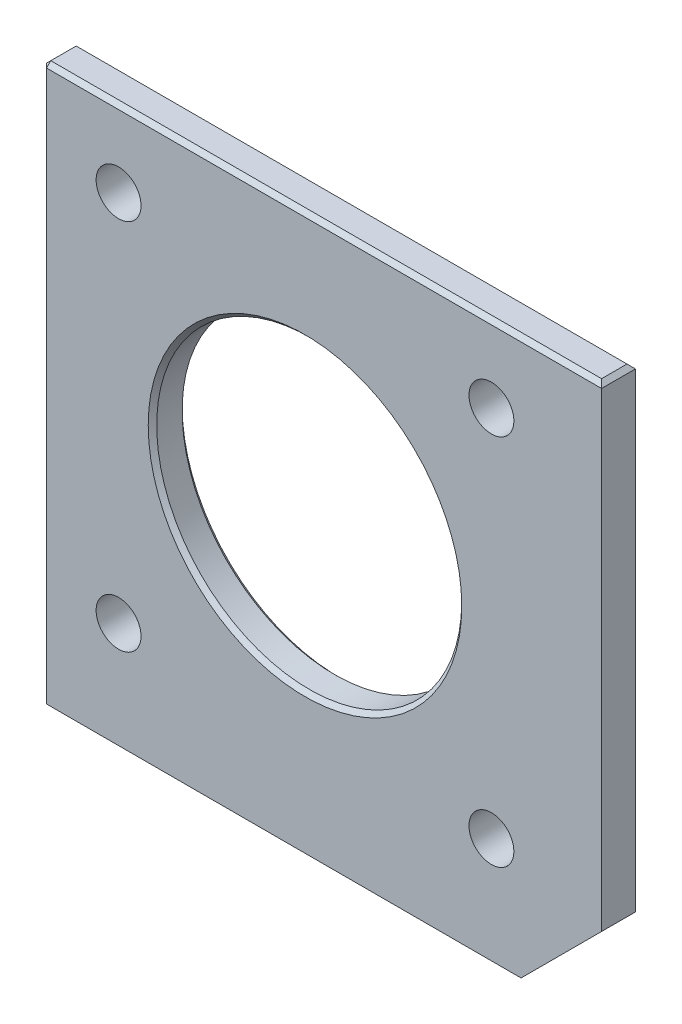
ISO-10303-21;
HEADER;
FILE_DESCRIPTION(('STEP AP214'),'2;1');
FILE_NAME('part.step','',(''),(''),'','','');
FILE_SCHEMA(('AUTOMOTIVE_DESIGN { 1 0 10303 214 1 1 1 1 }'));
ENDSEC;
DATA;
#1=APPLICATION_CONTEXT('core data for automotive mechanical design processes');
#2=APPLICATION_PROTOCOL_DEFINITION('international standard','automotive_design',2000,#1);
#3=PRODUCT_CONTEXT('',#1,'mechanical');
#4=PRODUCT('Part','Part','',(#3));
#5=PRODUCT_RELATED_PRODUCT_CATEGORY('part','',(#4));
#6=PRODUCT_DEFINITION_FORMATION('','',#4);
#7=PRODUCT_DEFINITION_CONTEXT('part definition',#1,'design');
#8=PRODUCT_DEFINITION('design','',#6,#7);
#9=PRODUCT_DEFINITION_SHAPE('','',#8);
#10=(LENGTH_UNIT() NAMED_UNIT(*) SI_UNIT(.MILLI.,.METRE.));
#11=(NAMED_UNIT(*) PLANE_ANGLE_UNIT() SI_UNIT($,.RADIAN.));
#12=(NAMED_UNIT(*) SI_UNIT($,.STERADIAN.) SOLID_ANGLE_UNIT());
#13=UNCERTAINTY_MEASURE_WITH_UNIT(LENGTH_MEASURE(1.E-05),#10,'distance_accuracy_value','');
#14=(GEOMETRIC_REPRESENTATION_CONTEXT(3) GLOBAL_UNCERTAINTY_ASSIGNED_CONTEXT((#13)) GLOBAL_UNIT_ASSIGNED_CONTEXT((#10,
#11,#12)) REPRESENTATION_CONTEXT('',''));
#15=CARTESIAN_POINT('',(0.,0.,0.));
#16=DIRECTION('',(0.,0.,1.));
#17=DIRECTION('',(1.,0.,0.));
#18=AXIS2_PLACEMENT_3D('',#15,#16,#17);
#19=CARTESIAN_POINT('',(0.,0.,4.));
#20=DIRECTION('',(0.,0.,1.));
#21=DIRECTION('',(1.,0.,0.));
#22=AXIS2_PLACEMENT_3D('',#19,#20,#21);
#23=PLANE('',#22);
#24=CARTESIAN_POINT('',(-24.,24.,4.));
#25=DIRECTION('',(0.,0.,1.));
#26=DIRECTION('',(1.,0.,0.));
#27=AXIS2_PLACEMENT_3D('',#24,#25,#26);
#28=CIRCLE('',#27,2.64999999999999);
#29=CARTESIAN_POINT('',(-21.35,24.,4.));
#30=VERTEX_POINT('',#29);
#31=EDGE_CURVE('E494',#30,#30,#28,.T.);
#32=ORIENTED_EDGE('',*,*,#31,.F.);
#33=EDGE_LOOP('',(#32));
#34=FACE_BOUND('',#33,.T.);
#35=CARTESIAN_POINT('',(20.,24.,4.));
#36=DIRECTION('',(0.,0.,1.));
#37=DIRECTION('',(1.,0.,0.));
#38=AXIS2_PLACEMENT_3D('',#35,#36,#37);
#39=CIRCLE('',#38,2.64999999999999);
#40=CARTESIAN_POINT('',(22.65,24.,4.));
#41=VERTEX_POINT('',#40);
#42=EDGE_CURVE('E498',#41,#41,#39,.T.);
#43=ORIENTED_EDGE('',*,*,#42,.F.);
#44=EDGE_LOOP('',(#43));
#45=FACE_BOUND('',#44,.T.);
#46=CARTESIAN_POINT('',(20.,-20.,4.));
#47=DIRECTION('',(0.,0.,1.));
#48=DIRECTION('',(1.,0.,0.));
#49=AXIS2_PLACEMENT_3D('',#46,#47,#48);
#50=CIRCLE('',#49,2.64999999999999);
#51=CARTESIAN_POINT('',(22.65,-20.,4.));
#52=VERTEX_POINT('',#51);
#53=EDGE_CURVE('E508',#52,#52,#50,.T.);
#54=ORIENTED_EDGE('',*,*,#53,.F.);
#55=EDGE_LOOP('',(#54));
#56=FACE_BOUND('',#55,.T.);
#57=CARTESIAN_POINT('',(-24.,-20.,4.));
#58=DIRECTION('',(0.,0.,1.));
#59=DIRECTION('',(1.,0.,0.));
#60=AXIS2_PLACEMENT_3D('',#57,#58,#59);
#61=CIRCLE('',#60,2.64999999999999);
#62=CARTESIAN_POINT('',(-21.35,-20.,4.));
#63=VERTEX_POINT('',#62);
#64=EDGE_CURVE('E516',#63,#63,#61,.T.);
#65=ORIENTED_EDGE('',*,*,#64,.F.);
#66=EDGE_LOOP('',(#65));
#67=FACE_BOUND('',#66,.T.);
#68=CARTESIAN_POINT('',(-2.,1.99999999999999,4.));
#69=DIRECTION('',(0.,0.,1.));
#70=DIRECTION('',(1.,0.,0.));
#71=AXIS2_PLACEMENT_3D('',#68,#69,#70);
#72=CIRCLE('',#71,18.5);
#73=CARTESIAN_POINT('',(16.5,1.99999999999999,4.));
#74=VERTEX_POINT('',#73);
#75=EDGE_CURVE('E165',#74,#74,#72,.F.);
#76=ORIENTED_EDGE('',*,*,#75,.T.);
#77=EDGE_LOOP('',(#76));
#78=FACE_BOUND('',#77,.T.);
#79=DIRECTION('',(0.,1.,0.));
#80=VECTOR('',#79,1.);
#81=CARTESIAN_POINT('',(33.,33.,4.));
#82=LINE('',#81,#80);
#83=CARTESIAN_POINT('',(33.,-23.,4.));
#84=VERTEX_POINT('',#83);
#85=CARTESIAN_POINT('',(33.,32.5,4.));
#86=VERTEX_POINT('',#85);
#87=EDGE_CURVE('E145',#84,#86,#82,.T.);
#88=ORIENTED_EDGE('',*,*,#87,.T.);
#89=DIRECTION('',(-1.,0.,0.));
#90=VECTOR('',#89,1.);
#91=CARTESIAN_POINT('',(-33.,32.5,4.));
#92=LINE('',#91,#90);
#93=CARTESIAN_POINT('',(-32.5,32.5,4.));
#94=VERTEX_POINT('',#93);
#95=EDGE_CURVE('E176',#86,#94,#92,.T.);
#96=ORIENTED_EDGE('',*,*,#95,.T.);
#97=DIRECTION('',(0.,-1.,0.));
#98=VECTOR('',#97,1.);
#99=CARTESIAN_POINT('',(-32.5,-33.,4.));
#100=LINE('',#99,#98);
#101=CARTESIAN_POINT('',(-32.5,-32.5,4.));
#102=VERTEX_POINT('',#101);
#103=EDGE_CURVE('E172',#94,#102,#100,.T.);
#104=ORIENTED_EDGE('',*,*,#103,.T.);
#105=DIRECTION('',(1.,0.,0.));
#106=VECTOR('',#105,1.);
#107=CARTESIAN_POINT('',(23.,-32.5,4.));
#108=LINE('',#107,#106);
#109=CARTESIAN_POINT('',(23.5,-32.5,4.));
#110=VERTEX_POINT('',#109);
#111=EDGE_CURVE('E169',#102,#110,#108,.T.);
#112=ORIENTED_EDGE('',*,*,#111,.T.);
#113=DIRECTION('',(-0.707106781186549,-0.707106781186546,0.));
#114=VECTOR('',#113,1.);
#115=CARTESIAN_POINT('',(27.9999999999999,-28.0000000000001,4.));
#116=LINE('',#115,#114);
#117=EDGE_CURVE('E162',#110,#84,#116,.F.);
#118=ORIENTED_EDGE('',*,*,#117,.T.);
#119=EDGE_LOOP('',(#88,#96,#104,#112,#118));
#120=FACE_BOUND('',#119,.T.);
#121=ADVANCED_FACE('F39',(#34,#45,#56,#67,#78,#120),#23,.T.);
#122=CARTESIAN_POINT('',(0.,0.,0.));
#123=DIRECTION('',(0.,0.,1.));
#124=DIRECTION('',(1.,0.,0.));
#125=AXIS2_PLACEMENT_3D('',#122,#123,#124);
#126=PLANE('',#125);
#127=CARTESIAN_POINT('',(-24.,24.,0.));
#128=DIRECTION('',(0.,0.,1.));
#129=DIRECTION('',(1.,0.,0.));
#130=AXIS2_PLACEMENT_3D('',#127,#128,#129);
#131=CIRCLE('',#130,2.65);
#132=CARTESIAN_POINT('',(-21.35,24.,0.));
#133=VERTEX_POINT('',#132);
#134=EDGE_CURVE('E492',#133,#133,#131,.T.);
#135=ORIENTED_EDGE('',*,*,#134,.T.);
#136=EDGE_LOOP('',(#135));
#137=FACE_BOUND('',#136,.T.);
#138=CARTESIAN_POINT('',(20.,24.,0.));
#139=DIRECTION('',(0.,0.,1.));
#140=DIRECTION('',(1.,0.,0.));
#141=AXIS2_PLACEMENT_3D('',#138,#139,#140);
#142=CIRCLE('',#141,2.65);
#143=CARTESIAN_POINT('',(22.65,24.,0.));
#144=VERTEX_POINT('',#143);
#145=EDGE_CURVE('E504',#144,#144,#142,.T.);
#146=ORIENTED_EDGE('',*,*,#145,.T.);
#147=EDGE_LOOP('',(#146));
#148=FACE_BOUND('',#147,.T.);
#149=CARTESIAN_POINT('',(20.,-20.,0.));
#150=DIRECTION('',(0.,0.,1.));
#151=DIRECTION('',(1.,0.,0.));
#152=AXIS2_PLACEMENT_3D('',#149,#150,#151);
#153=CIRCLE('',#152,2.65);
#154=CARTESIAN_POINT('',(22.65,-20.,0.));
#155=VERTEX_POINT('',#154);
#156=EDGE_CURVE('E512',#155,#155,#153,.T.);
#157=ORIENTED_EDGE('',*,*,#156,.T.);
#158=EDGE_LOOP('',(#157));
#159=FACE_BOUND('',#158,.T.);
#160=CARTESIAN_POINT('',(-24.,-20.,0.));
#161=DIRECTION('',(0.,0.,1.));
#162=DIRECTION('',(1.,0.,0.));
#163=AXIS2_PLACEMENT_3D('',#160,#161,#162);
#164=CIRCLE('',#163,2.65);
#165=CARTESIAN_POINT('',(-21.35,-20.,0.));
#166=VERTEX_POINT('',#165);
#167=EDGE_CURVE('E239',#166,#166,#164,.T.);
#168=ORIENTED_EDGE('',*,*,#167,.T.);
#169=EDGE_LOOP('',(#168));
#170=FACE_BOUND('',#169,.T.);
#171=CARTESIAN_POINT('',(-2.,1.99999999999999,0.));
#172=DIRECTION('',(0.,0.,1.));
#173=DIRECTION('',(1.,0.,0.));
#174=AXIS2_PLACEMENT_3D('',#171,#172,#173);
#175=CIRCLE('',#174,18.5);
#176=CARTESIAN_POINT('',(16.5,1.99999999999999,0.));
#177=VERTEX_POINT('',#176);
#178=EDGE_CURVE('E208',#177,#177,#175,.T.);
#179=ORIENTED_EDGE('',*,*,#178,.T.);
#180=EDGE_LOOP('',(#179));
#181=FACE_BOUND('',#180,.T.);
#182=DIRECTION('',(0.,1.,0.));
#183=VECTOR('',#182,1.);
#184=CARTESIAN_POINT('',(-32.5,0.,0.));
#185=LINE('',#184,#183);
#186=CARTESIAN_POINT('',(-32.5,-32.5,0.));
#187=VERTEX_POINT('',#186);
#188=CARTESIAN_POINT('',(-32.5,32.5,0.));
#189=VERTEX_POINT('',#188);
#190=EDGE_CURVE('E215',#187,#189,#185,.T.);
#191=ORIENTED_EDGE('',*,*,#190,.T.);
#192=DIRECTION('',(1.,0.,0.));
#193=VECTOR('',#192,1.);
#194=CARTESIAN_POINT('',(0.,32.5,0.));
#195=LINE('',#194,#193);
#196=CARTESIAN_POINT('',(33.,32.5,0.));
#197=VERTEX_POINT('',#196);
#198=EDGE_CURVE('E150',#189,#197,#195,.T.);
#199=ORIENTED_EDGE('',*,*,#198,.T.);
#200=DIRECTION('',(0.,1.,0.));
#201=VECTOR('',#200,1.);
#202=CARTESIAN_POINT('',(33.,33.,0.));
#203=LINE('',#202,#201);
#204=CARTESIAN_POINT('',(33.,-23.,0.));
#205=VERTEX_POINT('',#204);
#206=EDGE_CURVE('E142',#205,#197,#203,.T.);
#207=ORIENTED_EDGE('',*,*,#206,.F.);
#208=DIRECTION('',(0.707106781186549,0.707106781186546,0.));
#209=VECTOR('',#208,1.);
#210=CARTESIAN_POINT('',(33.,-23.,0.));
#211=LINE('',#210,#209);
#212=CARTESIAN_POINT('',(23.5,-32.5,0.));
#213=VERTEX_POINT('',#212);
#214=EDGE_CURVE('E124',#205,#213,#211,.F.);
#215=ORIENTED_EDGE('',*,*,#214,.T.);
#216=DIRECTION('',(-1.,0.,0.));
#217=VECTOR('',#216,1.);
#218=CARTESIAN_POINT('',(0.,-32.5,0.));
#219=LINE('',#218,#217);
#220=EDGE_CURVE('E212',#213,#187,#219,.T.);
#221=ORIENTED_EDGE('',*,*,#220,.T.);
#222=EDGE_LOOP('',(#191,#199,#207,#215,#221));
#223=FACE_BOUND('',#222,.T.);
#224=ADVANCED_FACE('F148',(#137,#148,#159,#170,#181,#223),#126,.F.);
#225=CARTESIAN_POINT('',(33.,33.,4.));
#226=DIRECTION('',(-1.,0.,0.));
#227=DIRECTION('',(0.,-1.,0.));
#228=AXIS2_PLACEMENT_3D('',#225,#226,#227);
#229=PLANE('',#228);
#230=ORIENTED_EDGE('',*,*,#206,.T.);
#231=DIRECTION('',(0.,0.,1.));
#232=VECTOR('',#231,1.);
#233=CARTESIAN_POINT('',(33.,32.5,4.));
#234=LINE('',#233,#232);
#235=EDGE_CURVE('E205',#197,#86,#234,.T.);
#236=ORIENTED_EDGE('',*,*,#235,.T.);
#237=ORIENTED_EDGE('',*,*,#87,.F.);
#238=DIRECTION('',(0.,0.,-1.));
#239=VECTOR('',#238,1.);
#240=CARTESIAN_POINT('',(33.,-23.,4.));
#241=LINE('',#240,#239);
#242=EDGE_CURVE('E129',#84,#205,#241,.T.);
#243=ORIENTED_EDGE('',*,*,#242,.T.);
#244=EDGE_LOOP('',(#230,#236,#237,#243));
#245=FACE_BOUND('',#244,.T.);
#246=ADVANCED_FACE('F141',(#245),#229,.F.);
#247=CARTESIAN_POINT('',(-33.,33.,4.));
#248=DIRECTION('',(0.,-1.,0.));
#249=DIRECTION('',(0.,0.,-1.));
#250=AXIS2_PLACEMENT_3D('',#247,#248,#249);
#251=PLANE('',#250);
#252=DIRECTION('',(1.,0.,0.));
#253=VECTOR('',#252,1.);
#254=CARTESIAN_POINT('',(33.,33.,3.50000000000003));
#255=LINE('',#254,#253);
#256=CARTESIAN_POINT('',(-32.5,33.,3.50000000000003));
#257=VERTEX_POINT('',#256);
#258=CARTESIAN_POINT('',(32.5,33.,3.50000000000003));
#259=VERTEX_POINT('',#258);
#260=EDGE_CURVE('E198',#257,#259,#255,.T.);
#261=ORIENTED_EDGE('',*,*,#260,.T.);
#262=DIRECTION('',(0.,0.,-1.));
#263=VECTOR('',#262,1.);
#264=CARTESIAN_POINT('',(32.5,33.,4.));
#265=LINE('',#264,#263);
#266=CARTESIAN_POINT('',(32.5,33.,0.499999999999973));
#267=VERTEX_POINT('',#266);
#268=EDGE_CURVE('E201',#259,#267,#265,.T.);
#269=ORIENTED_EDGE('',*,*,#268,.T.);
#270=DIRECTION('',(-1.,0.,0.));
#271=VECTOR('',#270,1.);
#272=CARTESIAN_POINT('',(-33.,33.,0.499999999999973));
#273=LINE('',#272,#271);
#274=CARTESIAN_POINT('',(-32.5,33.,0.499999999999973));
#275=VERTEX_POINT('',#274);
#276=EDGE_CURVE('E192',#267,#275,#273,.T.);
#277=ORIENTED_EDGE('',*,*,#276,.T.);
#278=DIRECTION('',(0.,0.,1.));
#279=VECTOR('',#278,1.);
#280=CARTESIAN_POINT('',(-32.5,33.,4.));
#281=LINE('',#280,#279);
#282=EDGE_CURVE('E195',#275,#257,#281,.T.);
#283=ORIENTED_EDGE('',*,*,#282,.T.);
#284=EDGE_LOOP('',(#261,#269,#277,#283));
#285=FACE_BOUND('',#284,.T.);
#286=ADVANCED_FACE('F310',(#285),#251,.F.);
#287=CARTESIAN_POINT('',(-33.,33.,4.));
#288=DIRECTION('',(1.,0.,0.));
#289=DIRECTION('',(0.,1.,0.));
#290=AXIS2_PLACEMENT_3D('',#287,#288,#289);
#291=PLANE('',#290);
#292=DIRECTION('',(0.,0.,1.));
#293=VECTOR('',#292,1.);
#294=CARTESIAN_POINT('',(-33.,-32.5,4.));
#295=LINE('',#294,#293);
#296=CARTESIAN_POINT('',(-33.,-32.5,0.499999999999973));
#297=VERTEX_POINT('',#296);
#298=CARTESIAN_POINT('',(-33.,-32.5,3.50000000000003));
#299=VERTEX_POINT('',#298);
#300=EDGE_CURVE('E179',#297,#299,#295,.T.);
#301=ORIENTED_EDGE('',*,*,#300,.T.);
#302=DIRECTION('',(0.,1.,0.));
#303=VECTOR('',#302,1.);
#304=CARTESIAN_POINT('',(-33.,33.,3.50000000000003));
#305=LINE('',#304,#303);
#306=CARTESIAN_POINT('',(-33.,32.5,3.50000000000003));
#307=VERTEX_POINT('',#306);
#308=EDGE_CURVE('E188',#299,#307,#305,.T.);
#309=ORIENTED_EDGE('',*,*,#308,.T.);
#310=DIRECTION('',(0.,0.,-1.));
#311=VECTOR('',#310,1.);
#312=CARTESIAN_POINT('',(-33.,32.5,4.));
#313=LINE('',#312,#311);
#314=CARTESIAN_POINT('',(-33.,32.5,0.499999999999973));
#315=VERTEX_POINT('',#314);
#316=EDGE_CURVE('E185',#307,#315,#313,.T.);
#317=ORIENTED_EDGE('',*,*,#316,.T.);
#318=DIRECTION('',(0.,-1.,0.));
#319=VECTOR('',#318,1.);
#320=CARTESIAN_POINT('',(-33.,33.,0.499999999999973));
#321=LINE('',#320,#319);
#322=EDGE_CURVE('E182',#315,#297,#321,.T.);
#323=ORIENTED_EDGE('',*,*,#322,.T.);
#324=EDGE_LOOP('',(#301,#309,#317,#323));
#325=FACE_BOUND('',#324,.T.);
#326=ADVANCED_FACE('F300',(#325),#291,.F.);
#327=CARTESIAN_POINT('',(-33.,-33.,4.));
#328=DIRECTION('',(0.,1.,0.));
#329=DIRECTION('',(0.,0.,1.));
#330=AXIS2_PLACEMENT_3D('',#327,#328,#329);
#331=PLANE('',#330);
#332=DIRECTION('',(0.,0.,-1.));
#333=VECTOR('',#332,1.);
#334=CARTESIAN_POINT('',(-32.5,-33.,4.));
#335=LINE('',#334,#333);
#336=CARTESIAN_POINT('',(-32.5,-33.,3.50000000000003));
#337=VERTEX_POINT('',#336);
#338=CARTESIAN_POINT('',(-32.5,-33.,0.499999999999973));
#339=VERTEX_POINT('',#338);
#340=EDGE_CURVE('E57',#337,#339,#335,.T.);
#341=ORIENTED_EDGE('',*,*,#340,.T.);
#342=DIRECTION('',(1.,0.,0.));
#343=VECTOR('',#342,1.);
#344=CARTESIAN_POINT('',(-33.,-33.,0.499999999999973));
#345=LINE('',#344,#343);
#346=CARTESIAN_POINT('',(23.,-33.,0.499999999999973));
#347=VERTEX_POINT('',#346);
#348=EDGE_CURVE('E224',#339,#347,#345,.T.);
#349=ORIENTED_EDGE('',*,*,#348,.T.);
#350=DIRECTION('',(0.,0.,1.));
#351=VECTOR('',#350,1.);
#352=CARTESIAN_POINT('',(23.,-33.,4.));
#353=LINE('',#352,#351);
#354=CARTESIAN_POINT('',(23.,-33.,3.50000000000003));
#355=VERTEX_POINT('',#354);
#356=EDGE_CURVE('E136',#347,#355,#353,.T.);
#357=ORIENTED_EDGE('',*,*,#356,.T.);
#358=DIRECTION('',(-1.,0.,0.));
#359=VECTOR('',#358,1.);
#360=CARTESIAN_POINT('',(-33.,-33.,3.50000000000003));
#361=LINE('',#360,#359);
#362=EDGE_CURVE('E62',#355,#337,#361,.T.);
#363=ORIENTED_EDGE('',*,*,#362,.T.);
#364=EDGE_LOOP('',(#341,#349,#357,#363));
#365=FACE_BOUND('',#364,.T.);
#366=ADVANCED_FACE('F358',(#365),#331,.F.);
#367=CARTESIAN_POINT('',(-2.,1.99999999999999,4.));
#368=DIRECTION('',(0.,0.,-1.));
#369=DIRECTION('',(-1.,0.,0.));
#370=AXIS2_PLACEMENT_3D('',#367,#368,#369);
#371=CYLINDRICAL_SURFACE('',#370,18.);
#372=CARTESIAN_POINT('',(-2.,1.99999999999999,0.49999999999999));
#373=DIRECTION('',(0.,0.,1.));
#374=DIRECTION('',(1.,0.,0.));
#375=AXIS2_PLACEMENT_3D('',#372,#373,#374);
#376=CIRCLE('',#375,18.);
#377=CARTESIAN_POINT('',(16.,1.99999999999999,0.49999999999999));
#378=VERTEX_POINT('',#377);
#379=EDGE_CURVE('E11',#378,#378,#376,.F.);
#380=ORIENTED_EDGE('',*,*,#379,.T.);
#381=EDGE_LOOP('',(#380));
#382=FACE_BOUND('',#381,.T.);
#383=CARTESIAN_POINT('',(-2.,1.99999999999999,3.49999999999999));
#384=DIRECTION('',(0.,0.,1.));
#385=DIRECTION('',(1.,0.,0.));
#386=AXIS2_PLACEMENT_3D('',#383,#384,#385);
#387=CIRCLE('',#386,18.);
#388=CARTESIAN_POINT('',(16.,1.99999999999999,3.49999999999999));
#389=VERTEX_POINT('',#388);
#390=EDGE_CURVE('E49',#389,#389,#387,.T.);
#391=ORIENTED_EDGE('',*,*,#390,.T.);
#392=EDGE_LOOP('',(#391));
#393=FACE_BOUND('',#392,.T.);
#394=ADVANCED_FACE('F355',(#382,#393),#371,.F.);
#395=CARTESIAN_POINT('',(33.,-23.,4.));
#396=DIRECTION('',(-0.707106781186546,0.707106781186549,0.));
#397=DIRECTION('',(0.,0.,-1.));
#398=AXIS2_PLACEMENT_3D('',#395,#396,#397);
#399=PLANE('',#398);
#400=ORIENTED_EDGE('',*,*,#356,.F.);
#401=DIRECTION('',(0.577350269189628,0.577350269189625,-0.577350269189625));
#402=VECTOR('',#401,1.);
#403=CARTESIAN_POINT('',(28.5,-27.5,-5.00000000000003));
#404=LINE('',#403,#402);
#405=EDGE_CURVE('E131',#347,#213,#404,.T.);
#406=ORIENTED_EDGE('',*,*,#405,.T.);
#407=ORIENTED_EDGE('',*,*,#214,.F.);
#408=ORIENTED_EDGE('',*,*,#242,.F.);
#409=ORIENTED_EDGE('',*,*,#117,.F.);
#410=DIRECTION('',(0.577350269189628,0.577350269189625,0.577350269189625));
#411=VECTOR('',#410,1.);
#412=CARTESIAN_POINT('',(29.8333333333333,-26.1666666666667,10.3333333333334));
#413=LINE('',#412,#411);
#414=EDGE_CURVE('E227',#110,#355,#413,.F.);
#415=ORIENTED_EDGE('',*,*,#414,.T.);
#416=EDGE_LOOP('',(#400,#406,#407,#408,#409,#415));
#417=FACE_BOUND('',#416,.T.);
#418=ADVANCED_FACE('F127',(#417),#399,.F.);
#419=CARTESIAN_POINT('',(-33.,33.,0.499999999999973));
#420=DIRECTION('',(0.,-0.707106781186547,0.707106781186547));
#421=DIRECTION('',(-1.,0.,0.));
#422=AXIS2_PLACEMENT_3D('',#419,#420,#421);
#423=PLANE('',#422);
#424=DIRECTION('',(0.577350269189626,-0.577350269189626,-0.577350269189626));
#425=VECTOR('',#424,1.);
#426=CARTESIAN_POINT('',(10.6666666666667,54.8333333333333,22.3333333333333));
#427=LINE('',#426,#425);
#428=EDGE_CURVE('E278',#197,#267,#427,.F.);
#429=ORIENTED_EDGE('',*,*,#428,.F.);
#430=ORIENTED_EDGE('',*,*,#198,.F.);
#431=DIRECTION('',(0.,0.707106781186547,0.707106781186547));
#432=VECTOR('',#431,1.);
#433=CARTESIAN_POINT('',(-32.5,32.75,0.249999999999983));
#434=LINE('',#433,#432);
#435=EDGE_CURVE('E157',#275,#189,#434,.F.);
#436=ORIENTED_EDGE('',*,*,#435,.F.);
#437=ORIENTED_EDGE('',*,*,#276,.F.);
#438=EDGE_LOOP('',(#429,#430,#436,#437));
#439=FACE_BOUND('',#438,.T.);
#440=ADVANCED_FACE('F290',(#439),#423,.F.);
#441=CARTESIAN_POINT('',(-33.,-33.,0.499999999999973));
#442=DIRECTION('',(0.,0.707106781186547,0.707106781186547));
#443=DIRECTION('',(1.,0.,0.));
#444=AXIS2_PLACEMENT_3D('',#441,#442,#443);
#445=PLANE('',#444);
#446=ORIENTED_EDGE('',*,*,#405,.F.);
#447=ORIENTED_EDGE('',*,*,#348,.F.);
#448=DIRECTION('',(0.,0.707106781186547,-0.707106781186547));
#449=VECTOR('',#448,1.);
#450=CARTESIAN_POINT('',(-32.5,-32.75,0.249999999999983));
#451=LINE('',#450,#449);
#452=EDGE_CURVE('E274',#187,#339,#451,.F.);
#453=ORIENTED_EDGE('',*,*,#452,.F.);
#454=ORIENTED_EDGE('',*,*,#220,.F.);
#455=EDGE_LOOP('',(#446,#447,#453,#454));
#456=FACE_BOUND('',#455,.T.);
#457=ADVANCED_FACE('F385',(#456),#445,.F.);
#458=CARTESIAN_POINT('',(-33.,33.,0.499999999999973));
#459=DIRECTION('',(0.70710678118655,0.,0.707106781186545));
#460=DIRECTION('',(0.,-1.,0.));
#461=AXIS2_PLACEMENT_3D('',#458,#459,#460);
#462=PLANE('',#461);
#463=DIRECTION('',(0.707106781186545,0.,-0.70710678118655));
#464=VECTOR('',#463,1.);
#465=CARTESIAN_POINT('',(-33.,32.5,0.499999999999973));
#466=LINE('',#465,#464);
#467=EDGE_CURVE('E43',#189,#315,#466,.F.);
#468=ORIENTED_EDGE('',*,*,#467,.F.);
#469=ORIENTED_EDGE('',*,*,#190,.F.);
#470=DIRECTION('',(-0.707106781186545,0.,0.70710678118655));
#471=VECTOR('',#470,1.);
#472=CARTESIAN_POINT('',(-33.,-32.5,0.499999999999973));
#473=LINE('',#472,#471);
#474=EDGE_CURVE('E270',#297,#187,#473,.F.);
#475=ORIENTED_EDGE('',*,*,#474,.F.);
#476=ORIENTED_EDGE('',*,*,#322,.F.);
#477=EDGE_LOOP('',(#468,#469,#475,#476));
#478=FACE_BOUND('',#477,.T.);
#479=ADVANCED_FACE('F295',(#478),#462,.F.);
#480=CARTESIAN_POINT('',(-33.,32.5,0.499999999999973));
#481=DIRECTION('',(-0.577350269189628,0.577350269189628,-0.577350269189621));
#482=DIRECTION('',(-0.707106781186548,-0.707106781186548,0.));
#483=AXIS2_PLACEMENT_3D('',#480,#481,#482);
#484=PLANE('',#483);
#485=ORIENTED_EDGE('',*,*,#435,.T.);
#486=ORIENTED_EDGE('',*,*,#467,.T.);
#487=DIRECTION('',(-0.707106781186548,-0.707106781186548,0.));
#488=VECTOR('',#487,1.);
#489=CARTESIAN_POINT('',(-33.,32.5,0.499999999999973));
#490=LINE('',#489,#488);
#491=EDGE_CURVE('E266',#275,#315,#490,.T.);
#492=ORIENTED_EDGE('',*,*,#491,.F.);
#493=EDGE_LOOP('',(#485,#486,#492));
#494=FACE_BOUND('',#493,.T.);
#495=ADVANCED_FACE('F285',(#494),#484,.T.);
#496=CARTESIAN_POINT('',(32.5,33.,4.));
#497=DIRECTION('',(-0.707106781186547,-0.707106781186547,0.));
#498=DIRECTION('',(0.,0.,-1.));
#499=AXIS2_PLACEMENT_3D('',#496,#497,#498);
#500=PLANE('',#499);
#501=ORIENTED_EDGE('',*,*,#428,.T.);
#502=ORIENTED_EDGE('',*,*,#268,.F.);
#503=DIRECTION('',(0.577350269189626,-0.577350269189626,0.577350269189626));
#504=VECTOR('',#503,1.);
#505=CARTESIAN_POINT('',(22.,43.5,-7.));
#506=LINE('',#505,#504);
#507=EDGE_CURVE('E262',#86,#259,#506,.F.);
#508=ORIENTED_EDGE('',*,*,#507,.F.);
#509=ORIENTED_EDGE('',*,*,#235,.F.);
#510=EDGE_LOOP('',(#501,#502,#508,#509));
#511=FACE_BOUND('',#510,.T.);
#512=ADVANCED_FACE('F319',(#511),#500,.F.);
#513=CARTESIAN_POINT('',(-33.,-32.5,0.499999999999973));
#514=DIRECTION('',(-0.577350269189628,-0.577350269189628,-0.577350269189621));
#515=DIRECTION('',(0.707106781186548,-0.707106781186548,0.));
#516=AXIS2_PLACEMENT_3D('',#513,#514,#515);
#517=PLANE('',#516);
#518=ORIENTED_EDGE('',*,*,#474,.T.);
#519=ORIENTED_EDGE('',*,*,#452,.T.);
#520=DIRECTION('',(0.707106781186548,-0.707106781186548,0.));
#521=VECTOR('',#520,1.);
#522=CARTESIAN_POINT('',(-33.,-32.5,0.499999999999973));
#523=LINE('',#522,#521);
#524=EDGE_CURVE('E258',#297,#339,#523,.T.);
#525=ORIENTED_EDGE('',*,*,#524,.F.);
#526=EDGE_LOOP('',(#518,#519,#525));
#527=FACE_BOUND('',#526,.T.);
#528=ADVANCED_FACE('F395',(#527),#517,.T.);
#529=CARTESIAN_POINT('',(-33.,32.5,4.));
#530=DIRECTION('',(0.707106781186547,-0.707106781186547,0.));
#531=DIRECTION('',(0.,0.,-1.));
#532=AXIS2_PLACEMENT_3D('',#529,#530,#531);
#533=PLANE('',#532);
#534=ORIENTED_EDGE('',*,*,#491,.T.);
#535=ORIENTED_EDGE('',*,*,#316,.F.);
#536=DIRECTION('',(0.707106781186547,0.707106781186547,0.));
#537=VECTOR('',#536,1.);
#538=CARTESIAN_POINT('',(-33.,32.5,3.50000000000003));
#539=LINE('',#538,#537);
#540=EDGE_CURVE('E254',#257,#307,#539,.F.);
#541=ORIENTED_EDGE('',*,*,#540,.F.);
#542=ORIENTED_EDGE('',*,*,#282,.F.);
#543=EDGE_LOOP('',(#534,#535,#541,#542));
#544=FACE_BOUND('',#543,.T.);
#545=ADVANCED_FACE('F307',(#544),#533,.F.);
#546=CARTESIAN_POINT('',(0.,32.5,4.));
#547=DIRECTION('',(0.,0.707106781186547,0.707106781186547));
#548=DIRECTION('',(1.,0.,0.));
#549=AXIS2_PLACEMENT_3D('',#546,#547,#548);
#550=PLANE('',#549);
#551=ORIENTED_EDGE('',*,*,#507,.T.);
#552=ORIENTED_EDGE('',*,*,#260,.F.);
#553=DIRECTION('',(0.,0.707106781186547,-0.707106781186547));
#554=VECTOR('',#553,1.);
#555=CARTESIAN_POINT('',(-32.5,32.75,3.75000000000001));
#556=LINE('',#555,#554);
#557=EDGE_CURVE('E250',#94,#257,#556,.T.);
#558=ORIENTED_EDGE('',*,*,#557,.F.);
#559=ORIENTED_EDGE('',*,*,#95,.F.);
#560=EDGE_LOOP('',(#551,#552,#558,#559));
#561=FACE_BOUND('',#560,.T.);
#562=ADVANCED_FACE('F314',(#561),#550,.T.);
#563=CARTESIAN_POINT('',(0.,-32.5,4.));
#564=DIRECTION('',(0.,-0.707106781186547,0.707106781186547));
#565=DIRECTION('',(-1.,0.,0.));
#566=AXIS2_PLACEMENT_3D('',#563,#564,#565);
#567=PLANE('',#566);
#568=ORIENTED_EDGE('',*,*,#414,.F.);
#569=ORIENTED_EDGE('',*,*,#111,.F.);
#570=DIRECTION('',(0.,0.707106781186547,0.707106781186547));
#571=VECTOR('',#570,1.);
#572=CARTESIAN_POINT('',(-32.5,-32.5,4.));
#573=LINE('',#572,#571);
#574=EDGE_CURVE('E246',#337,#102,#573,.T.);
#575=ORIENTED_EDGE('',*,*,#574,.F.);
#576=ORIENTED_EDGE('',*,*,#362,.F.);
#577=EDGE_LOOP('',(#568,#569,#575,#576));
#578=FACE_BOUND('',#577,.T.);
#579=ADVANCED_FACE('F324',(#578),#567,.T.);
#580=CARTESIAN_POINT('',(-32.5,-33.,4.));
#581=DIRECTION('',(0.707106781186547,0.707106781186547,0.));
#582=DIRECTION('',(0.,0.,-1.));
#583=AXIS2_PLACEMENT_3D('',#580,#581,#582);
#584=PLANE('',#583);
#585=ORIENTED_EDGE('',*,*,#524,.T.);
#586=ORIENTED_EDGE('',*,*,#340,.F.);
#587=DIRECTION('',(-0.707106781186547,0.707106781186547,0.));
#588=VECTOR('',#587,1.);
#589=CARTESIAN_POINT('',(-32.75,-32.75,3.50000000000003));
#590=LINE('',#589,#588);
#591=EDGE_CURVE('E242',#299,#337,#590,.F.);
#592=ORIENTED_EDGE('',*,*,#591,.F.);
#593=ORIENTED_EDGE('',*,*,#300,.F.);
#594=EDGE_LOOP('',(#585,#586,#592,#593));
#595=FACE_BOUND('',#594,.T.);
#596=ADVANCED_FACE('F330',(#595),#584,.F.);
#597=CARTESIAN_POINT('',(-33.,32.5,3.50000000000003));
#598=DIRECTION('',(-0.577350269189626,0.577350269189626,0.577350269189626));
#599=DIRECTION('',(0.707106781186547,0.,0.707106781186547));
#600=AXIS2_PLACEMENT_3D('',#597,#598,#599);
#601=PLANE('',#600);
#602=ORIENTED_EDGE('',*,*,#557,.T.);
#603=ORIENTED_EDGE('',*,*,#540,.T.);
#604=DIRECTION('',(0.707106781186545,0.,0.70710678118655));
#605=VECTOR('',#604,1.);
#606=CARTESIAN_POINT('',(-33.,32.5,3.50000000000003));
#607=LINE('',#606,#605);
#608=EDGE_CURVE('E238',#94,#307,#607,.F.);
#609=ORIENTED_EDGE('',*,*,#608,.F.);
#610=EDGE_LOOP('',(#602,#603,#609));
#611=FACE_BOUND('',#610,.T.);
#612=ADVANCED_FACE('F335',(#611),#601,.T.);
#613=CARTESIAN_POINT('',(-32.5,-32.5,4.));
#614=DIRECTION('',(-0.577350269189626,-0.577350269189626,0.577350269189626));
#615=DIRECTION('',(0.707106781186547,0.,0.707106781186547));
#616=AXIS2_PLACEMENT_3D('',#613,#614,#615);
#617=PLANE('',#616);
#618=ORIENTED_EDGE('',*,*,#591,.T.);
#619=ORIENTED_EDGE('',*,*,#574,.T.);
#620=DIRECTION('',(-0.707106781186545,0.,-0.70710678118655));
#621=VECTOR('',#620,1.);
#622=CARTESIAN_POINT('',(-32.5,-32.5,4.));
#623=LINE('',#622,#621);
#624=EDGE_CURVE('E235',#299,#102,#623,.F.);
#625=ORIENTED_EDGE('',*,*,#624,.F.);
#626=EDGE_LOOP('',(#618,#619,#625));
#627=FACE_BOUND('',#626,.T.);
#628=ADVANCED_FACE('F328',(#627),#617,.T.);
#629=CARTESIAN_POINT('',(-32.5,0.,4.));
#630=DIRECTION('',(-0.70710678118655,0.,0.707106781186545));
#631=DIRECTION('',(0.,1.,0.));
#632=AXIS2_PLACEMENT_3D('',#629,#630,#631);
#633=PLANE('',#632);
#634=ORIENTED_EDGE('',*,*,#608,.T.);
#635=ORIENTED_EDGE('',*,*,#308,.F.);
#636=ORIENTED_EDGE('',*,*,#624,.T.);
#637=ORIENTED_EDGE('',*,*,#103,.F.);
#638=EDGE_LOOP('',(#634,#635,#636,#637));
#639=FACE_BOUND('',#638,.T.);
#640=ADVANCED_FACE('F332',(#639),#633,.T.);
#641=CARTESIAN_POINT('',(-2.,1.99999999999999,0.));
#642=DIRECTION('',(0.,0.,-1.));
#643=DIRECTION('',(-1.,0.,0.));
#644=AXIS2_PLACEMENT_3D('',#641,#642,#643);
#645=CONICAL_SURFACE('',#644,18.5,0.785398163397441);
#646=ORIENTED_EDGE('',*,*,#379,.F.);
#647=EDGE_LOOP('',(#646));
#648=FACE_BOUND('',#647,.T.);
#649=ORIENTED_EDGE('',*,*,#178,.F.);
#650=EDGE_LOOP('',(#649));
#651=FACE_BOUND('',#650,.T.);
#652=ADVANCED_FACE('F370',(#648,#651),#645,.F.);
#653=CARTESIAN_POINT('',(-2.,1.99999999999999,3.49999999999999));
#654=DIRECTION('',(0.,0.,1.));
#655=DIRECTION('',(1.,0.,0.));
#656=AXIS2_PLACEMENT_3D('',#653,#654,#655);
#657=CONICAL_SURFACE('',#656,18.,0.785398163397441);
#658=ORIENTED_EDGE('',*,*,#75,.F.);
#659=EDGE_LOOP('',(#658));
#660=FACE_BOUND('',#659,.T.);
#661=ORIENTED_EDGE('',*,*,#390,.F.);
#662=EDGE_LOOP('',(#661));
#663=FACE_BOUND('',#662,.T.);
#664=ADVANCED_FACE('F41',(#660,#663),#657,.F.);
#665=CARTESIAN_POINT('',(-24.,-20.,4.));
#666=DIRECTION('',(0.,0.,1.));
#667=DIRECTION('',(1.,0.,0.));
#668=AXIS2_PLACEMENT_3D('',#665,#666,#667);
#669=CYLINDRICAL_SURFACE('',#668,2.64999999999999);
#670=ORIENTED_EDGE('',*,*,#167,.F.);
#671=EDGE_LOOP('',(#670));
#672=FACE_BOUND('',#671,.T.);
#673=ORIENTED_EDGE('',*,*,#64,.T.);
#674=EDGE_LOOP('',(#673));
#675=FACE_BOUND('',#674,.T.);
#676=ADVANCED_FACE('F378',(#672,#675),#669,.F.);
#677=CARTESIAN_POINT('',(20.,-20.,4.));
#678=DIRECTION('',(0.,0.,1.));
#679=DIRECTION('',(1.,0.,0.));
#680=AXIS2_PLACEMENT_3D('',#677,#678,#679);
#681=CYLINDRICAL_SURFACE('',#680,2.64999999999999);
#682=ORIENTED_EDGE('',*,*,#156,.F.);
#683=EDGE_LOOP('',(#682));
#684=FACE_BOUND('',#683,.T.);
#685=ORIENTED_EDGE('',*,*,#53,.T.);
#686=EDGE_LOOP('',(#685));
#687=FACE_BOUND('',#686,.T.);
#688=ADVANCED_FACE('F456',(#684,#687),#681,.F.);
#689=CARTESIAN_POINT('',(20.,24.,4.));
#690=DIRECTION('',(0.,0.,1.));
#691=DIRECTION('',(1.,0.,0.));
#692=AXIS2_PLACEMENT_3D('',#689,#690,#691);
#693=CYLINDRICAL_SURFACE('',#692,2.64999999999999);
#694=ORIENTED_EDGE('',*,*,#145,.F.);
#695=EDGE_LOOP('',(#694));
#696=FACE_BOUND('',#695,.T.);
#697=ORIENTED_EDGE('',*,*,#42,.T.);
#698=EDGE_LOOP('',(#697));
#699=FACE_BOUND('',#698,.T.);
#700=ADVANCED_FACE('F465',(#696,#699),#693,.F.);
#701=CARTESIAN_POINT('',(-24.,24.,4.));
#702=DIRECTION('',(0.,0.,1.));
#703=DIRECTION('',(1.,0.,0.));
#704=AXIS2_PLACEMENT_3D('',#701,#702,#703);
#705=CYLINDRICAL_SURFACE('',#704,2.64999999999999);
#706=ORIENTED_EDGE('',*,*,#134,.F.);
#707=EDGE_LOOP('',(#706));
#708=FACE_BOUND('',#707,.T.);
#709=ORIENTED_EDGE('',*,*,#31,.T.);
#710=EDGE_LOOP('',(#709));
#711=FACE_BOUND('',#710,.T.);
#712=ADVANCED_FACE('F475',(#708,#711),#705,.F.);
#713=CLOSED_SHELL('',(#121,#224,#246,#286,#326,#366,#394,#418,#440,#457,#479,#495,#512,#528,
#545,#562,#579,#596,#612,#628,#640,#652,#664,#676,#688,#700,#712));
#714=MANIFOLD_SOLID_BREP('B2',#713);
#715=ADVANCED_BREP_SHAPE_REPRESENTATION('',(#18,#714),#14);
#716=SHAPE_DEFINITION_REPRESENTATION(#9,#715);
ENDSEC;
END-ISO-10303-21;
